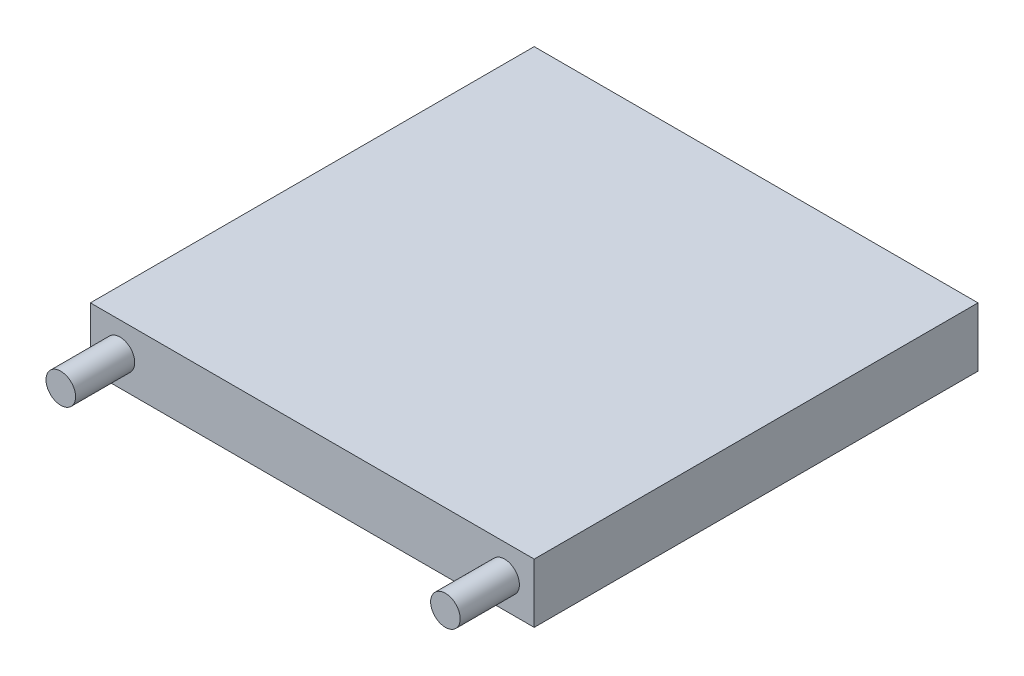
ISO-10303-21;
HEADER;
FILE_DESCRIPTION(('STEP AP214'),'2;1');
FILE_NAME('part.step','',(''),(''),'','','');
FILE_SCHEMA(('AUTOMOTIVE_DESIGN { 1 0 10303 214 1 1 1 1 }'));
ENDSEC;
DATA;
#1=APPLICATION_CONTEXT('core data for automotive mechanical design processes');
#2=APPLICATION_PROTOCOL_DEFINITION('international standard','automotive_design',2000,#1);
#3=PRODUCT_CONTEXT('',#1,'mechanical');
#4=PRODUCT('Part','Part','',(#3));
#5=PRODUCT_RELATED_PRODUCT_CATEGORY('part','',(#4));
#6=PRODUCT_DEFINITION_FORMATION('','',#4);
#7=PRODUCT_DEFINITION_CONTEXT('part definition',#1,'design');
#8=PRODUCT_DEFINITION('design','',#6,#7);
#9=PRODUCT_DEFINITION_SHAPE('','',#8);
#10=(LENGTH_UNIT() NAMED_UNIT(*) SI_UNIT(.MILLI.,.METRE.));
#11=(NAMED_UNIT(*) PLANE_ANGLE_UNIT() SI_UNIT($,.RADIAN.));
#12=(NAMED_UNIT(*) SI_UNIT($,.STERADIAN.) SOLID_ANGLE_UNIT());
#13=UNCERTAINTY_MEASURE_WITH_UNIT(LENGTH_MEASURE(1.E-05),#10,'distance_accuracy_value','');
#14=(GEOMETRIC_REPRESENTATION_CONTEXT(3) GLOBAL_UNCERTAINTY_ASSIGNED_CONTEXT((#13)) GLOBAL_UNIT_ASSIGNED_CONTEXT((#10,
#11,#12)) REPRESENTATION_CONTEXT('',''));
#15=CARTESIAN_POINT('',(0.,0.,0.));
#16=DIRECTION('',(0.,0.,1.));
#17=DIRECTION('',(1.,0.,0.));
#18=AXIS2_PLACEMENT_3D('',#15,#16,#17);
#19=CARTESIAN_POINT('',(15.,4.,15.));
#20=DIRECTION('',(-1.,0.,0.));
#21=DIRECTION('',(0.,0.,1.));
#22=AXIS2_PLACEMENT_3D('',#19,#20,#21);
#23=PLANE('',#22);
#24=DIRECTION('',(0.,0.,-1.));
#25=VECTOR('',#24,1.);
#26=CARTESIAN_POINT('',(15.,0.,15.));
#27=LINE('',#26,#25);
#28=CARTESIAN_POINT('',(15.,0.,15.));
#29=VERTEX_POINT('',#28);
#30=CARTESIAN_POINT('',(15.,0.,-15.));
#31=VERTEX_POINT('',#30);
#32=EDGE_CURVE('E102',#29,#31,#27,.T.);
#33=ORIENTED_EDGE('',*,*,#32,.T.);
#34=DIRECTION('',(0.,-1.,0.));
#35=VECTOR('',#34,1.);
#36=CARTESIAN_POINT('',(15.,4.,-15.));
#37=LINE('',#36,#35);
#38=CARTESIAN_POINT('',(15.,4.,-15.));
#39=VERTEX_POINT('',#38);
#40=EDGE_CURVE('E93',#39,#31,#37,.T.);
#41=ORIENTED_EDGE('',*,*,#40,.F.);
#42=DIRECTION('',(0.,0.,-1.));
#43=VECTOR('',#42,1.);
#44=CARTESIAN_POINT('',(15.,4.,15.));
#45=LINE('',#44,#43);
#46=CARTESIAN_POINT('',(15.,4.,15.));
#47=VERTEX_POINT('',#46);
#48=EDGE_CURVE('E87',#47,#39,#45,.T.);
#49=ORIENTED_EDGE('',*,*,#48,.F.);
#50=DIRECTION('',(0.,-1.,0.));
#51=VECTOR('',#50,1.);
#52=CARTESIAN_POINT('',(15.,4.,15.));
#53=LINE('',#52,#51);
#54=EDGE_CURVE('E98',#47,#29,#53,.T.);
#55=ORIENTED_EDGE('',*,*,#54,.T.);
#56=EDGE_LOOP('',(#33,#41,#49,#55));
#57=FACE_BOUND('',#56,.T.);
#58=ADVANCED_FACE('F35',(#57),#23,.F.);
#59=CARTESIAN_POINT('',(-15.,4.,-15.));
#60=DIRECTION('',(0.,0.,1.));
#61=DIRECTION('',(1.,0.,0.));
#62=AXIS2_PLACEMENT_3D('',#59,#60,#61);
#63=PLANE('',#62);
#64=DIRECTION('',(-1.,0.,0.));
#65=VECTOR('',#64,1.);
#66=CARTESIAN_POINT('',(-15.,0.,-15.));
#67=LINE('',#66,#65);
#68=CARTESIAN_POINT('',(-15.,0.,-15.));
#69=VERTEX_POINT('',#68);
#70=EDGE_CURVE('E92',#31,#69,#67,.T.);
#71=ORIENTED_EDGE('',*,*,#70,.T.);
#72=DIRECTION('',(0.,-1.,0.));
#73=VECTOR('',#72,1.);
#74=CARTESIAN_POINT('',(-15.,4.,-15.));
#75=LINE('',#74,#73);
#76=CARTESIAN_POINT('',(-15.,4.,-15.));
#77=VERTEX_POINT('',#76);
#78=EDGE_CURVE('E90',#77,#69,#75,.T.);
#79=ORIENTED_EDGE('',*,*,#78,.F.);
#80=DIRECTION('',(-1.,0.,0.));
#81=VECTOR('',#80,1.);
#82=CARTESIAN_POINT('',(-15.,4.,-15.));
#83=LINE('',#82,#81);
#84=EDGE_CURVE('E82',#39,#77,#83,.T.);
#85=ORIENTED_EDGE('',*,*,#84,.F.);
#86=ORIENTED_EDGE('',*,*,#40,.T.);
#87=EDGE_LOOP('',(#71,#79,#85,#86));
#88=FACE_BOUND('',#87,.T.);
#89=ADVANCED_FACE('F91',(#88),#63,.F.);
#90=CARTESIAN_POINT('',(-15.,4.,15.));
#91=DIRECTION('',(1.,0.,0.));
#92=DIRECTION('',(0.,0.,-1.));
#93=AXIS2_PLACEMENT_3D('',#90,#91,#92);
#94=PLANE('',#93);
#95=DIRECTION('',(0.,0.,1.));
#96=VECTOR('',#95,1.);
#97=CARTESIAN_POINT('',(-15.,0.,15.));
#98=LINE('',#97,#96);
#99=CARTESIAN_POINT('',(-15.,0.,15.));
#100=VERTEX_POINT('',#99);
#101=EDGE_CURVE('E68',#69,#100,#98,.T.);
#102=ORIENTED_EDGE('',*,*,#101,.T.);
#103=DIRECTION('',(0.,-1.,0.));
#104=VECTOR('',#103,1.);
#105=CARTESIAN_POINT('',(-15.,4.,15.));
#106=LINE('',#105,#104);
#107=CARTESIAN_POINT('',(-15.,4.,15.));
#108=VERTEX_POINT('',#107);
#109=EDGE_CURVE('E94',#108,#100,#106,.T.);
#110=ORIENTED_EDGE('',*,*,#109,.F.);
#111=DIRECTION('',(0.,0.,1.));
#112=VECTOR('',#111,1.);
#113=CARTESIAN_POINT('',(-15.,4.,15.));
#114=LINE('',#113,#112);
#115=EDGE_CURVE('E85',#77,#108,#114,.T.);
#116=ORIENTED_EDGE('',*,*,#115,.F.);
#117=ORIENTED_EDGE('',*,*,#78,.T.);
#118=EDGE_LOOP('',(#102,#110,#116,#117));
#119=FACE_BOUND('',#118,.T.);
#120=ADVANCED_FACE('F96',(#119),#94,.F.);
#121=CARTESIAN_POINT('',(-15.,4.,15.));
#122=DIRECTION('',(0.,0.,-1.));
#123=DIRECTION('',(-1.,0.,0.));
#124=AXIS2_PLACEMENT_3D('',#121,#122,#123);
#125=PLANE('',#124);
#126=CARTESIAN_POINT('',(13.,2.,15.));
#127=DIRECTION('',(0.,0.,-1.));
#128=DIRECTION('',(-1.,0.,0.));
#129=AXIS2_PLACEMENT_3D('',#126,#127,#128);
#130=CIRCLE('',#129,1.);
#131=CARTESIAN_POINT('',(12.,2.,15.));
#132=VERTEX_POINT('',#131);
#133=EDGE_CURVE('E11',#132,#132,#130,.F.);
#134=ORIENTED_EDGE('',*,*,#133,.F.);
#135=EDGE_LOOP('',(#134));
#136=FACE_BOUND('',#135,.T.);
#137=CARTESIAN_POINT('',(-13.,2.,15.));
#138=DIRECTION('',(0.,0.,-1.));
#139=DIRECTION('',(-1.,0.,0.));
#140=AXIS2_PLACEMENT_3D('',#137,#138,#139);
#141=CIRCLE('',#140,1.);
#142=CARTESIAN_POINT('',(-14.,2.,15.));
#143=VERTEX_POINT('',#142);
#144=EDGE_CURVE('E43',#143,#143,#141,.F.);
#145=ORIENTED_EDGE('',*,*,#144,.F.);
#146=EDGE_LOOP('',(#145));
#147=FACE_BOUND('',#146,.T.);
#148=DIRECTION('',(1.,0.,0.));
#149=VECTOR('',#148,1.);
#150=CARTESIAN_POINT('',(-15.,0.,15.));
#151=LINE('',#150,#149);
#152=EDGE_CURVE('E74',#100,#29,#151,.T.);
#153=ORIENTED_EDGE('',*,*,#152,.T.);
#154=ORIENTED_EDGE('',*,*,#54,.F.);
#155=DIRECTION('',(1.,0.,0.));
#156=VECTOR('',#155,1.);
#157=CARTESIAN_POINT('',(-15.,4.,15.));
#158=LINE('',#157,#156);
#159=EDGE_CURVE('E51',#108,#47,#158,.T.);
#160=ORIENTED_EDGE('',*,*,#159,.F.);
#161=ORIENTED_EDGE('',*,*,#109,.T.);
#162=EDGE_LOOP('',(#153,#154,#160,#161));
#163=FACE_BOUND('',#162,.T.);
#164=ADVANCED_FACE('F116',(#136,#147,#163),#125,.F.);
#165=CARTESIAN_POINT('',(0.,4.,0.));
#166=DIRECTION('',(0.,-1.,0.));
#167=DIRECTION('',(0.,0.,-1.));
#168=AXIS2_PLACEMENT_3D('',#165,#166,#167);
#169=PLANE('',#168);
#170=ORIENTED_EDGE('',*,*,#48,.T.);
#171=ORIENTED_EDGE('',*,*,#84,.T.);
#172=ORIENTED_EDGE('',*,*,#115,.T.);
#173=ORIENTED_EDGE('',*,*,#159,.T.);
#174=EDGE_LOOP('',(#170,#171,#172,#173));
#175=FACE_BOUND('',#174,.T.);
#176=ADVANCED_FACE('F83',(#175),#169,.F.);
#177=CARTESIAN_POINT('',(0.,0.,0.));
#178=DIRECTION('',(0.,-1.,0.));
#179=DIRECTION('',(0.,0.,-1.));
#180=AXIS2_PLACEMENT_3D('',#177,#178,#179);
#181=PLANE('',#180);
#182=ORIENTED_EDGE('',*,*,#32,.F.);
#183=ORIENTED_EDGE('',*,*,#152,.F.);
#184=ORIENTED_EDGE('',*,*,#101,.F.);
#185=ORIENTED_EDGE('',*,*,#70,.F.);
#186=EDGE_LOOP('',(#182,#183,#184,#185));
#187=FACE_BOUND('',#186,.T.);
#188=ADVANCED_FACE('F124',(#187),#181,.T.);
#189=CARTESIAN_POINT('',(-13.,2.,19.));
#190=DIRECTION('',(0.,0.,-1.));
#191=DIRECTION('',(-1.,0.,0.));
#192=AXIS2_PLACEMENT_3D('',#189,#190,#191);
#193=CYLINDRICAL_SURFACE('',#192,1.);
#194=CARTESIAN_POINT('',(-13.,2.,19.));
#195=DIRECTION('',(0.,0.,1.));
#196=DIRECTION('',(1.,0.,0.));
#197=AXIS2_PLACEMENT_3D('',#194,#195,#196);
#198=CIRCLE('',#197,1.);
#199=CARTESIAN_POINT('',(-12.,2.,19.));
#200=VERTEX_POINT('',#199);
#201=EDGE_CURVE('E105',#200,#200,#198,.T.);
#202=ORIENTED_EDGE('',*,*,#201,.F.);
#203=EDGE_LOOP('',(#202));
#204=FACE_BOUND('',#203,.T.);
#205=ORIENTED_EDGE('',*,*,#144,.T.);
#206=EDGE_LOOP('',(#205));
#207=FACE_BOUND('',#206,.T.);
#208=ADVANCED_FACE('F114',(#204,#207),#193,.T.);
#209=CARTESIAN_POINT('',(-13.,2.,19.));
#210=DIRECTION('',(0.,0.,1.));
#211=DIRECTION('',(1.,0.,0.));
#212=AXIS2_PLACEMENT_3D('',#209,#210,#211);
#213=PLANE('',#212);
#214=ORIENTED_EDGE('',*,*,#201,.T.);
#215=EDGE_LOOP('',(#214));
#216=FACE_BOUND('',#215,.T.);
#217=ADVANCED_FACE('F140',(#216),#213,.T.);
#218=CARTESIAN_POINT('',(13.,2.,19.));
#219=DIRECTION('',(0.,0.,-1.));
#220=DIRECTION('',(-1.,0.,0.));
#221=AXIS2_PLACEMENT_3D('',#218,#219,#220);
#222=CYLINDRICAL_SURFACE('',#221,1.);
#223=CARTESIAN_POINT('',(13.,2.,19.));
#224=DIRECTION('',(0.,0.,1.));
#225=DIRECTION('',(-1.,0.,0.));
#226=AXIS2_PLACEMENT_3D('',#223,#224,#225);
#227=CIRCLE('',#226,1.);
#228=CARTESIAN_POINT('',(12.,2.,19.));
#229=VERTEX_POINT('',#228);
#230=EDGE_CURVE('E158',#229,#229,#227,.T.);
#231=ORIENTED_EDGE('',*,*,#230,.F.);
#232=EDGE_LOOP('',(#231));
#233=FACE_BOUND('',#232,.T.);
#234=ORIENTED_EDGE('',*,*,#133,.T.);
#235=EDGE_LOOP('',(#234));
#236=FACE_BOUND('',#235,.T.);
#237=ADVANCED_FACE('F146',(#233,#236),#222,.T.);
#238=CARTESIAN_POINT('',(13.,2.,19.));
#239=DIRECTION('',(0.,0.,-1.));
#240=DIRECTION('',(-1.,0.,0.));
#241=AXIS2_PLACEMENT_3D('',#238,#239,#240);
#242=PLANE('',#241);
#243=ORIENTED_EDGE('',*,*,#230,.T.);
#244=EDGE_LOOP('',(#243));
#245=FACE_BOUND('',#244,.T.);
#246=ADVANCED_FACE('F150',(#245),#242,.F.);
#247=CLOSED_SHELL('',(#58,#89,#120,#164,#176,#188,#208,#217,#237,#246));
#248=MANIFOLD_SOLID_BREP('B2',#247);
#249=ADVANCED_BREP_SHAPE_REPRESENTATION('',(#18,#248),#14);
#250=SHAPE_DEFINITION_REPRESENTATION(#9,#249);
ENDSEC;
END-ISO-10303-21;
